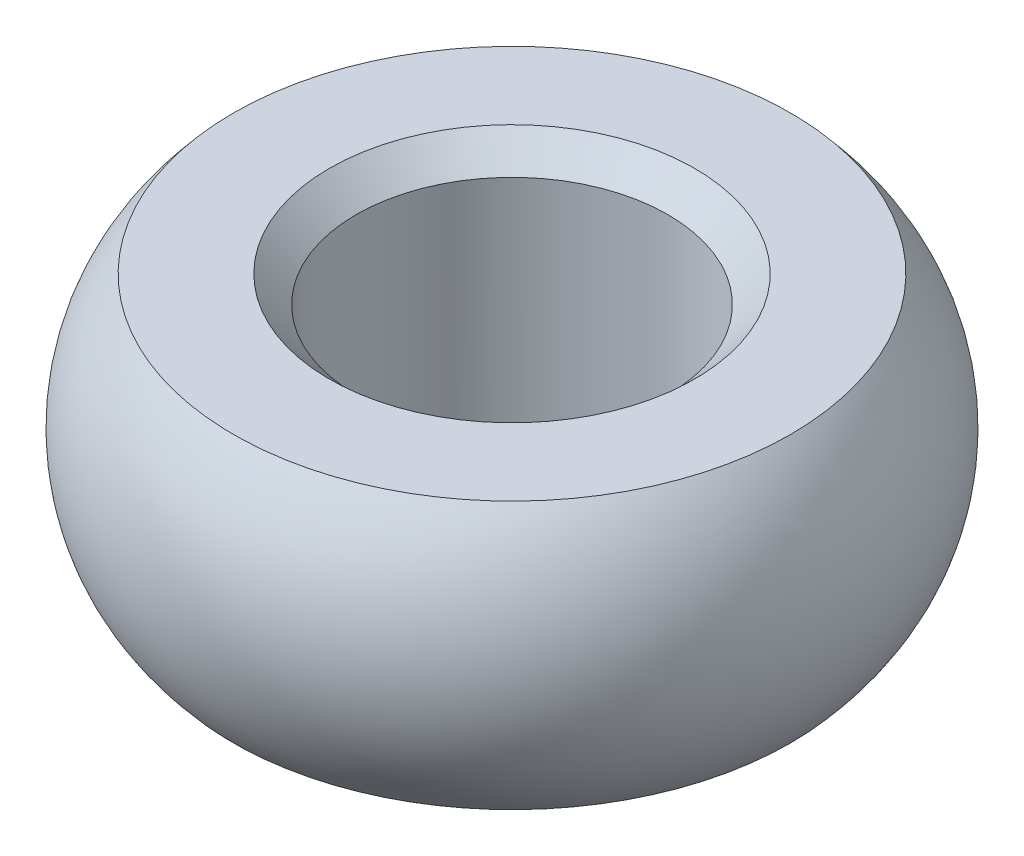
ISO-10303-21;
HEADER;
FILE_DESCRIPTION(('STEP AP214'),'2;1');
FILE_NAME('part.step','',(''),(''),'','','');
FILE_SCHEMA(('AUTOMOTIVE_DESIGN { 1 0 10303 214 1 1 1 1 }'));
ENDSEC;
DATA;
#1=APPLICATION_CONTEXT('core data for automotive mechanical design processes');
#2=APPLICATION_PROTOCOL_DEFINITION('international standard','automotive_design',2000,#1);
#3=PRODUCT_CONTEXT('',#1,'mechanical');
#4=PRODUCT('Part','Part','',(#3));
#5=PRODUCT_RELATED_PRODUCT_CATEGORY('part','',(#4));
#6=PRODUCT_DEFINITION_FORMATION('','',#4);
#7=PRODUCT_DEFINITION_CONTEXT('part definition',#1,'design');
#8=PRODUCT_DEFINITION('design','',#6,#7);
#9=PRODUCT_DEFINITION_SHAPE('','',#8);
#10=(LENGTH_UNIT() NAMED_UNIT(*) SI_UNIT(.MILLI.,.METRE.));
#11=(NAMED_UNIT(*) PLANE_ANGLE_UNIT() SI_UNIT($,.RADIAN.));
#12=(NAMED_UNIT(*) SI_UNIT($,.STERADIAN.) SOLID_ANGLE_UNIT());
#13=UNCERTAINTY_MEASURE_WITH_UNIT(LENGTH_MEASURE(1.E-05),#10,'distance_accuracy_value','');
#14=(GEOMETRIC_REPRESENTATION_CONTEXT(3) GLOBAL_UNCERTAINTY_ASSIGNED_CONTEXT((#13)) GLOBAL_UNIT_ASSIGNED_CONTEXT((#10,
#11,#12)) REPRESENTATION_CONTEXT('',''));
#15=CARTESIAN_POINT('',(0.,0.,0.));
#16=DIRECTION('',(0.,0.,1.));
#17=DIRECTION('',(1.,0.,0.));
#18=AXIS2_PLACEMENT_3D('',#15,#16,#17);
#19=CARTESIAN_POINT('',(17.5,15.,0.));
#20=DIRECTION('',(0.,1.,0.));
#21=DIRECTION('',(-1.,0.,0.));
#22=AXIS2_PLACEMENT_3D('',#19,#20,#21);
#23=PLANE('',#22);
#24=CARTESIAN_POINT('',(0.,14.9999999999999,0.));
#25=DIRECTION('',(0.,1.,0.));
#26=DIRECTION('',(-1.,0.,0.));
#27=AXIS2_PLACEMENT_3D('',#24,#25,#26);
#28=CIRCLE('',#27,20.5000000000001);
#29=CARTESIAN_POINT('',(-20.5000000000001,14.9999999999998,0.));
#30=VERTEX_POINT('',#29);
#31=EDGE_CURVE('E48',#30,#30,#28,.F.);
#32=ORIENTED_EDGE('',*,*,#31,.T.);
#33=EDGE_LOOP('',(#32));
#34=FACE_BOUND('',#33,.T.);
#35=CARTESIAN_POINT('',(0.,14.9999999999999,0.));
#36=DIRECTION('',(0.,-1.,0.));
#37=DIRECTION('',(1.,0.,0.));
#38=AXIS2_PLACEMENT_3D('',#35,#36,#37);
#39=CIRCLE('',#38,31.2705098312485);
#40=CARTESIAN_POINT('',(31.2705098312484,15.,0.));
#41=VERTEX_POINT('',#40);
#42=EDGE_CURVE('E53',#41,#41,#39,.T.);
#43=ORIENTED_EDGE('',*,*,#42,.F.);
#44=EDGE_LOOP('',(#43));
#45=FACE_BOUND('',#44,.T.);
#46=ADVANCED_FACE('F32',(#34,#45),#23,.T.);
#47=CARTESIAN_POINT('',(0.,0.,0.));
#48=DIRECTION('',(0.,-1.,0.));
#49=DIRECTION('',(1.,0.,0.));
#50=AXIS2_PLACEMENT_3D('',#47,#48,#49);
#51=DEGENERATE_TOROIDAL_SURFACE('',#50,14.5,22.5,.T.);
#52=ORIENTED_EDGE('',*,*,#42,.T.);
#53=EDGE_LOOP('',(#52));
#54=FACE_BOUND('',#53,.T.);
#55=CARTESIAN_POINT('',(0.,-15.0000000000001,0.));
#56=DIRECTION('',(0.,-1.,0.));
#57=DIRECTION('',(1.,0.,0.));
#58=AXIS2_PLACEMENT_3D('',#55,#56,#57);
#59=CIRCLE('',#58,31.2705098312484);
#60=CARTESIAN_POINT('',(31.2705098312484,-15.,0.));
#61=VERTEX_POINT('',#60);
#62=EDGE_CURVE('E56',#61,#61,#59,.T.);
#63=ORIENTED_EDGE('',*,*,#62,.F.);
#64=EDGE_LOOP('',(#63));
#65=FACE_BOUND('',#64,.T.);
#66=ADVANCED_FACE('F62',(#54,#65),#51,.T.);
#67=CARTESIAN_POINT('',(17.5,-15.,0.));
#68=DIRECTION('',(0.,-1.,0.));
#69=DIRECTION('',(1.,0.,0.));
#70=AXIS2_PLACEMENT_3D('',#67,#68,#69);
#71=PLANE('',#70);
#72=CARTESIAN_POINT('',(0.,-15.0000000000001,0.));
#73=DIRECTION('',(0.,-1.,0.));
#74=DIRECTION('',(1.,0.,0.));
#75=AXIS2_PLACEMENT_3D('',#72,#73,#74);
#76=CIRCLE('',#75,20.4999999999999);
#77=CARTESIAN_POINT('',(20.4999999999999,-15.,0.));
#78=VERTEX_POINT('',#77);
#79=EDGE_CURVE('E10',#78,#78,#76,.F.);
#80=ORIENTED_EDGE('',*,*,#79,.T.);
#81=EDGE_LOOP('',(#80));
#82=FACE_BOUND('',#81,.T.);
#83=ORIENTED_EDGE('',*,*,#62,.T.);
#84=EDGE_LOOP('',(#83));
#85=FACE_BOUND('',#84,.T.);
#86=ADVANCED_FACE('F60',(#82,#85),#71,.T.);
#87=CARTESIAN_POINT('',(1.93062209184187E-12,-562.822725833894,0.));
#88=DIRECTION('',(0.,-1.,0.));
#89=DIRECTION('',(1.,0.,0.));
#90=AXIS2_PLACEMENT_3D('',#87,#88,#89);
#91=CYLINDRICAL_SURFACE('',#90,17.5);
#92=CARTESIAN_POINT('',(0.,11.9999999999998,0.));
#93=DIRECTION('',(0.,1.,0.));
#94=DIRECTION('',(-1.,0.,0.));
#95=AXIS2_PLACEMENT_3D('',#92,#93,#94);
#96=CIRCLE('',#95,17.5);
#97=CARTESIAN_POINT('',(-17.5,11.9999999999997,0.));
#98=VERTEX_POINT('',#97);
#99=EDGE_CURVE('E40',#98,#98,#96,.T.);
#100=ORIENTED_EDGE('',*,*,#99,.T.);
#101=EDGE_LOOP('',(#100));
#102=FACE_BOUND('',#101,.T.);
#103=CARTESIAN_POINT('',(0.,-12.0000000000002,0.));
#104=DIRECTION('',(0.,-1.,0.));
#105=DIRECTION('',(1.,0.,0.));
#106=AXIS2_PLACEMENT_3D('',#103,#104,#105);
#107=CIRCLE('',#106,17.5);
#108=CARTESIAN_POINT('',(17.5,-12.0000000000002,0.));
#109=VERTEX_POINT('',#108);
#110=EDGE_CURVE('E44',#109,#109,#107,.T.);
#111=ORIENTED_EDGE('',*,*,#110,.T.);
#112=EDGE_LOOP('',(#111));
#113=FACE_BOUND('',#112,.T.);
#114=ADVANCED_FACE('F70',(#102,#113),#91,.F.);
#115=CARTESIAN_POINT('',(0.,14.9999999999999,0.));
#116=DIRECTION('',(0.,1.,0.));
#117=DIRECTION('',(-1.,0.,0.));
#118=AXIS2_PLACEMENT_3D('',#115,#116,#117);
#119=CONICAL_SURFACE('',#118,20.5000000000001,0.785398163397441);
#120=ORIENTED_EDGE('',*,*,#99,.F.);
#121=EDGE_LOOP('',(#120));
#122=FACE_BOUND('',#121,.T.);
#123=ORIENTED_EDGE('',*,*,#31,.F.);
#124=EDGE_LOOP('',(#123));
#125=FACE_BOUND('',#124,.T.);
#126=ADVANCED_FACE('F76',(#122,#125),#119,.F.);
#127=CARTESIAN_POINT('',(0.,-12.0000000000002,0.));
#128=DIRECTION('',(0.,-1.,0.));
#129=DIRECTION('',(1.,0.,0.));
#130=AXIS2_PLACEMENT_3D('',#127,#128,#129);
#131=CONICAL_SURFACE('',#130,17.5,0.785398163397452);
#132=ORIENTED_EDGE('',*,*,#79,.F.);
#133=EDGE_LOOP('',(#132));
#134=FACE_BOUND('',#133,.T.);
#135=ORIENTED_EDGE('',*,*,#110,.F.);
#136=EDGE_LOOP('',(#135));
#137=FACE_BOUND('',#136,.T.);
#138=ADVANCED_FACE('F35',(#134,#137),#131,.F.);
#139=CLOSED_SHELL('',(#46,#66,#86,#114,#126,#138));
#140=MANIFOLD_SOLID_BREP('B2',#139);
#141=ADVANCED_BREP_SHAPE_REPRESENTATION('',(#18,#140),#14);
#142=SHAPE_DEFINITION_REPRESENTATION(#9,#141);
ENDSEC;
END-ISO-10303-21;
